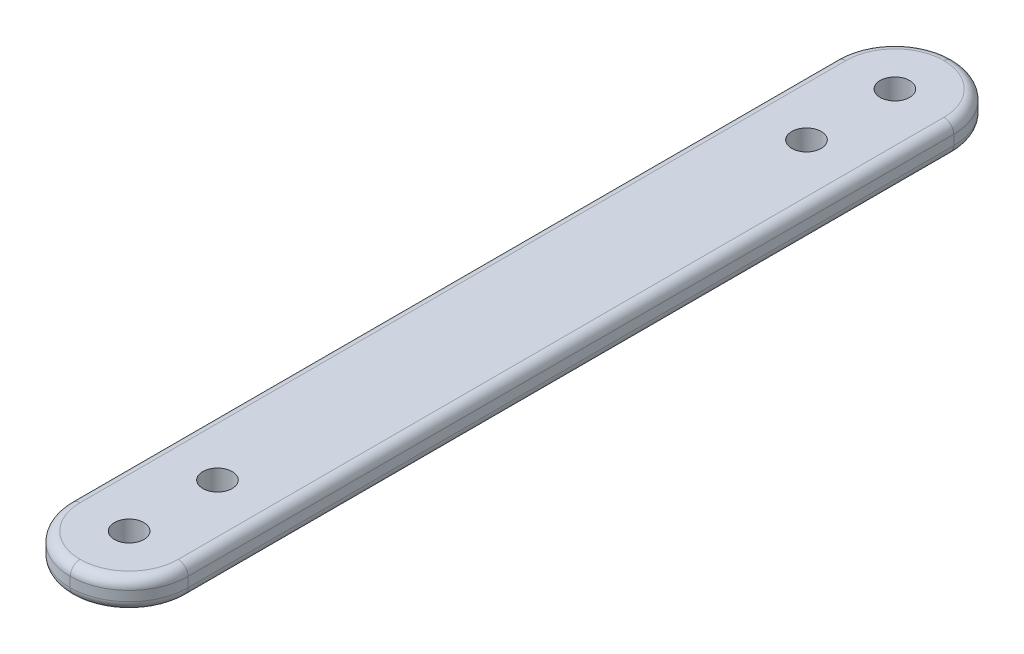
ISO-10303-21;
HEADER;
FILE_DESCRIPTION(('STEP AP214'),'2;1');
FILE_NAME('part.step','',(''),(''),'','','');
FILE_SCHEMA(('AUTOMOTIVE_DESIGN { 1 0 10303 214 1 1 1 1 }'));
ENDSEC;
DATA;
#1=APPLICATION_CONTEXT('core data for automotive mechanical design processes');
#2=APPLICATION_PROTOCOL_DEFINITION('international standard','automotive_design',2000,#1);
#3=PRODUCT_CONTEXT('',#1,'mechanical');
#4=PRODUCT('Part','Part','',(#3));
#5=PRODUCT_RELATED_PRODUCT_CATEGORY('part','',(#4));
#6=PRODUCT_DEFINITION_FORMATION('','',#4);
#7=PRODUCT_DEFINITION_CONTEXT('part definition',#1,'design');
#8=PRODUCT_DEFINITION('design','',#6,#7);
#9=PRODUCT_DEFINITION_SHAPE('','',#8);
#10=(LENGTH_UNIT() NAMED_UNIT(*) SI_UNIT(.MILLI.,.METRE.));
#11=(NAMED_UNIT(*) PLANE_ANGLE_UNIT() SI_UNIT($,.RADIAN.));
#12=(NAMED_UNIT(*) SI_UNIT($,.STERADIAN.) SOLID_ANGLE_UNIT());
#13=UNCERTAINTY_MEASURE_WITH_UNIT(LENGTH_MEASURE(1.E-05),#10,'distance_accuracy_value','');
#14=(GEOMETRIC_REPRESENTATION_CONTEXT(3) GLOBAL_UNCERTAINTY_ASSIGNED_CONTEXT((#13)) GLOBAL_UNIT_ASSIGNED_CONTEXT((#10,
#11,#12)) REPRESENTATION_CONTEXT('',''));
#15=CARTESIAN_POINT('',(0.,0.,0.));
#16=DIRECTION('',(0.,0.,1.));
#17=DIRECTION('',(1.,0.,0.));
#18=AXIS2_PLACEMENT_3D('',#15,#16,#17);
#19=CARTESIAN_POINT('',(0.,6.35,0.));
#20=DIRECTION('',(0.,-1.,0.));
#21=DIRECTION('',(0.,0.,-1.));
#22=AXIS2_PLACEMENT_3D('',#19,#20,#21);
#23=PLANE('',#22);
#24=CARTESIAN_POINT('',(0.,6.35,82.5500000000001));
#25=DIRECTION('',(0.,-1.,0.));
#26=DIRECTION('',(0.,0.,-1.));
#27=AXIS2_PLACEMENT_3D('',#24,#25,#26);
#28=CIRCLE('',#27,10.5833333333333);
#29=CARTESIAN_POINT('',(-10.5833333333333,6.35,82.5500000000001));
#30=VERTEX_POINT('',#29);
#31=CARTESIAN_POINT('',(0.,6.35,93.1333333333334));
#32=VERTEX_POINT('',#31);
#33=EDGE_CURVE('E150',#30,#32,#28,.F.);
#34=ORIENTED_EDGE('',*,*,#33,.T.);
#35=CARTESIAN_POINT('',(0.,6.35,82.5500000000001));
#36=DIRECTION('',(0.,-1.,0.));
#37=DIRECTION('',(0.,0.,-1.));
#38=AXIS2_PLACEMENT_3D('',#35,#36,#37);
#39=CIRCLE('',#38,10.5833333333333);
#40=CARTESIAN_POINT('',(10.5833333333333,6.35,82.5500000000001));
#41=VERTEX_POINT('',#40);
#42=EDGE_CURVE('E131',#32,#41,#39,.F.);
#43=ORIENTED_EDGE('',*,*,#42,.T.);
#44=DIRECTION('',(0.,0.,-1.));
#45=VECTOR('',#44,1.);
#46=CARTESIAN_POINT('',(10.5833333333333,6.35,0.));
#47=LINE('',#46,#45);
#48=CARTESIAN_POINT('',(10.5833333333333,6.35,-82.5499999999999));
#49=VERTEX_POINT('',#48);
#50=EDGE_CURVE('E139',#41,#49,#47,.T.);
#51=ORIENTED_EDGE('',*,*,#50,.T.);
#52=CARTESIAN_POINT('',(0.,6.35,-82.5499999999999));
#53=DIRECTION('',(0.,-1.,0.));
#54=DIRECTION('',(0.,0.,-1.));
#55=AXIS2_PLACEMENT_3D('',#52,#53,#54);
#56=CIRCLE('',#55,10.5833333333333);
#57=CARTESIAN_POINT('',(0.,6.35,-93.1333333333333));
#58=VERTEX_POINT('',#57);
#59=EDGE_CURVE('E145',#49,#58,#56,.F.);
#60=ORIENTED_EDGE('',*,*,#59,.T.);
#61=CARTESIAN_POINT('',(0.,6.35,-82.5499999999999));
#62=DIRECTION('',(0.,-1.,0.));
#63=DIRECTION('',(0.,0.,-1.));
#64=AXIS2_PLACEMENT_3D('',#61,#62,#63);
#65=CIRCLE('',#64,10.5833333333333);
#66=CARTESIAN_POINT('',(-10.5833333333333,6.35,-82.5499999999999));
#67=VERTEX_POINT('',#66);
#68=EDGE_CURVE('E254',#58,#67,#65,.F.);
#69=ORIENTED_EDGE('',*,*,#68,.T.);
#70=DIRECTION('',(0.,0.,1.));
#71=VECTOR('',#70,1.);
#72=CARTESIAN_POINT('',(-10.5833333333333,6.35,0.));
#73=LINE('',#72,#71);
#74=EDGE_CURVE('E156',#67,#30,#73,.T.);
#75=ORIENTED_EDGE('',*,*,#74,.T.);
#76=EDGE_LOOP('',(#34,#43,#51,#60,#69,#75));
#77=FACE_BOUND('',#76,.T.);
#78=CARTESIAN_POINT('',(0.,6.35,82.5500000000001));
#79=DIRECTION('',(0.,1.,0.));
#80=DIRECTION('',(0.,0.,1.));
#81=AXIS2_PLACEMENT_3D('',#78,#79,#80);
#82=CIRCLE('',#81,3.175);
#83=CARTESIAN_POINT('',(0.,6.35,85.7250000000001));
#84=VERTEX_POINT('',#83);
#85=EDGE_CURVE('E243',#84,#84,#82,.T.);
#86=ORIENTED_EDGE('',*,*,#85,.F.);
#87=EDGE_LOOP('',(#86));
#88=FACE_BOUND('',#87,.T.);
#89=CARTESIAN_POINT('',(0.,6.35,-63.4999999999999));
#90=DIRECTION('',(0.,1.,0.));
#91=DIRECTION('',(0.,0.,1.));
#92=AXIS2_PLACEMENT_3D('',#89,#90,#91);
#93=CIRCLE('',#92,3.175);
#94=CARTESIAN_POINT('',(0.,6.35,-60.3249999999999));
#95=VERTEX_POINT('',#94);
#96=EDGE_CURVE('E507',#95,#95,#93,.T.);
#97=ORIENTED_EDGE('',*,*,#96,.F.);
#98=EDGE_LOOP('',(#97));
#99=FACE_BOUND('',#98,.T.);
#100=CARTESIAN_POINT('',(0.,6.35,-82.5499999999999));
#101=DIRECTION('',(0.,1.,0.));
#102=DIRECTION('',(0.,0.,1.));
#103=AXIS2_PLACEMENT_3D('',#100,#101,#102);
#104=CIRCLE('',#103,3.17499999999999);
#105=CARTESIAN_POINT('',(0.,6.35,-79.3749999999999));
#106=VERTEX_POINT('',#105);
#107=EDGE_CURVE('E495',#106,#106,#104,.T.);
#108=ORIENTED_EDGE('',*,*,#107,.F.);
#109=EDGE_LOOP('',(#108));
#110=FACE_BOUND('',#109,.T.);
#111=CARTESIAN_POINT('',(0.,6.35,63.5000000000001));
#112=DIRECTION('',(0.,1.,0.));
#113=DIRECTION('',(0.,0.,1.));
#114=AXIS2_PLACEMENT_3D('',#111,#112,#113);
#115=CIRCLE('',#114,3.175);
#116=CARTESIAN_POINT('',(0.,6.35,66.6750000000001));
#117=VERTEX_POINT('',#116);
#118=EDGE_CURVE('E499',#117,#117,#115,.T.);
#119=ORIENTED_EDGE('',*,*,#118,.F.);
#120=EDGE_LOOP('',(#119));
#121=FACE_BOUND('',#120,.T.);
#122=ADVANCED_FACE('F34',(#77,#88,#99,#110,#121),#23,.F.);
#123=CARTESIAN_POINT('',(0.,0.,0.));
#124=DIRECTION('',(0.,-1.,0.));
#125=DIRECTION('',(0.,0.,-1.));
#126=AXIS2_PLACEMENT_3D('',#123,#124,#125);
#127=PLANE('',#126);
#128=DIRECTION('',(0.,0.,-1.));
#129=VECTOR('',#128,1.);
#130=CARTESIAN_POINT('',(10.5833333333333,0.,82.5500000000001));
#131=LINE('',#130,#129);
#132=CARTESIAN_POINT('',(10.5833333333333,0.,-82.5499999999999));
#133=VERTEX_POINT('',#132);
#134=CARTESIAN_POINT('',(10.5833333333333,0.,82.5500000000001));
#135=VERTEX_POINT('',#134);
#136=EDGE_CURVE('E177',#133,#135,#131,.F.);
#137=ORIENTED_EDGE('',*,*,#136,.T.);
#138=CARTESIAN_POINT('',(0.,0.,82.5500000000001));
#139=DIRECTION('',(0.,-1.,0.));
#140=DIRECTION('',(0.,0.,-1.));
#141=AXIS2_PLACEMENT_3D('',#138,#139,#140);
#142=CIRCLE('',#141,10.5833333333333);
#143=CARTESIAN_POINT('',(0.,0.,93.1333333333334));
#144=VERTEX_POINT('',#143);
#145=EDGE_CURVE('E186',#135,#144,#142,.T.);
#146=ORIENTED_EDGE('',*,*,#145,.T.);
#147=CARTESIAN_POINT('',(0.,0.,82.5500000000001));
#148=DIRECTION('',(0.,-1.,0.));
#149=DIRECTION('',(0.,0.,-1.));
#150=AXIS2_PLACEMENT_3D('',#147,#148,#149);
#151=CIRCLE('',#150,10.5833333333333);
#152=CARTESIAN_POINT('',(-10.5833333333333,0.,82.5500000000001));
#153=VERTEX_POINT('',#152);
#154=EDGE_CURVE('E58',#144,#153,#151,.T.);
#155=ORIENTED_EDGE('',*,*,#154,.T.);
#156=DIRECTION('',(0.,0.,1.));
#157=VECTOR('',#156,1.);
#158=CARTESIAN_POINT('',(-10.5833333333333,0.,-82.5499999999999));
#159=LINE('',#158,#157);
#160=CARTESIAN_POINT('',(-10.5833333333333,0.,-82.5499999999999));
#161=VERTEX_POINT('',#160);
#162=EDGE_CURVE('E183',#153,#161,#159,.F.);
#163=ORIENTED_EDGE('',*,*,#162,.T.);
#164=CARTESIAN_POINT('',(0.,0.,-82.5499999999999));
#165=DIRECTION('',(0.,-1.,0.));
#166=DIRECTION('',(0.,0.,-1.));
#167=AXIS2_PLACEMENT_3D('',#164,#165,#166);
#168=CIRCLE('',#167,10.5833333333333);
#169=CARTESIAN_POINT('',(0.,0.,-93.1333333333333));
#170=VERTEX_POINT('',#169);
#171=EDGE_CURVE('E181',#161,#170,#168,.T.);
#172=ORIENTED_EDGE('',*,*,#171,.T.);
#173=CARTESIAN_POINT('',(0.,0.,-82.5499999999999));
#174=DIRECTION('',(0.,-1.,0.));
#175=DIRECTION('',(0.,0.,-1.));
#176=AXIS2_PLACEMENT_3D('',#173,#174,#175);
#177=CIRCLE('',#176,10.5833333333333);
#178=EDGE_CURVE('E179',#170,#133,#177,.T.);
#179=ORIENTED_EDGE('',*,*,#178,.T.);
#180=EDGE_LOOP('',(#137,#146,#155,#163,#172,#179));
#181=FACE_BOUND('',#180,.T.);
#182=CARTESIAN_POINT('',(0.,0.,-82.5499999999999));
#183=DIRECTION('',(0.,1.,0.));
#184=DIRECTION('',(0.,0.,1.));
#185=AXIS2_PLACEMENT_3D('',#182,#183,#184);
#186=CIRCLE('',#185,3.17499999999999);
#187=CARTESIAN_POINT('',(0.,0.,-79.3749999999999));
#188=VERTEX_POINT('',#187);
#189=EDGE_CURVE('E498',#188,#188,#186,.T.);
#190=ORIENTED_EDGE('',*,*,#189,.T.);
#191=EDGE_LOOP('',(#190));
#192=FACE_BOUND('',#191,.T.);
#193=CARTESIAN_POINT('',(0.,0.,82.5500000000001));
#194=DIRECTION('',(0.,1.,0.));
#195=DIRECTION('',(0.,0.,1.));
#196=AXIS2_PLACEMENT_3D('',#193,#194,#195);
#197=CIRCLE('',#196,3.175);
#198=CARTESIAN_POINT('',(0.,0.,85.7250000000001));
#199=VERTEX_POINT('',#198);
#200=EDGE_CURVE('E510',#199,#199,#197,.T.);
#201=ORIENTED_EDGE('',*,*,#200,.T.);
#202=EDGE_LOOP('',(#201));
#203=FACE_BOUND('',#202,.T.);
#204=CARTESIAN_POINT('',(0.,0.,-63.4999999999999));
#205=DIRECTION('',(0.,1.,0.));
#206=DIRECTION('',(0.,0.,1.));
#207=AXIS2_PLACEMENT_3D('',#204,#205,#206);
#208=CIRCLE('',#207,3.175);
#209=CARTESIAN_POINT('',(0.,0.,-60.3249999999999));
#210=VERTEX_POINT('',#209);
#211=EDGE_CURVE('E501',#210,#210,#208,.T.);
#212=ORIENTED_EDGE('',*,*,#211,.T.);
#213=EDGE_LOOP('',(#212));
#214=FACE_BOUND('',#213,.T.);
#215=CARTESIAN_POINT('',(0.,0.,63.5000000000001));
#216=DIRECTION('',(0.,1.,0.));
#217=DIRECTION('',(0.,0.,1.));
#218=AXIS2_PLACEMENT_3D('',#215,#216,#217);
#219=CIRCLE('',#218,3.175);
#220=CARTESIAN_POINT('',(0.,0.,66.6750000000001));
#221=VERTEX_POINT('',#220);
#222=EDGE_CURVE('E250',#221,#221,#219,.T.);
#223=ORIENTED_EDGE('',*,*,#222,.T.);
#224=EDGE_LOOP('',(#223));
#225=FACE_BOUND('',#224,.T.);
#226=ADVANCED_FACE('F274',(#181,#192,#203,#214,#225),#127,.T.);
#227=CARTESIAN_POINT('',(12.7,6.35,95.2500000000001));
#228=DIRECTION('',(-1.,0.,0.));
#229=DIRECTION('',(0.,0.,1.));
#230=AXIS2_PLACEMENT_3D('',#227,#228,#229);
#231=PLANE('',#230);
#232=DIRECTION('',(0.,-1.,0.));
#233=VECTOR('',#232,1.);
#234=CARTESIAN_POINT('',(12.7,6.35,-82.5499999999999));
#235=LINE('',#234,#233);
#236=CARTESIAN_POINT('',(12.7,2.11666666666667,-82.5499999999999));
#237=VERTEX_POINT('',#236);
#238=CARTESIAN_POINT('',(12.7,4.23333333333333,-82.5499999999999));
#239=VERTEX_POINT('',#238);
#240=EDGE_CURVE('E146',#237,#239,#235,.F.);
#241=ORIENTED_EDGE('',*,*,#240,.T.);
#242=DIRECTION('',(0.,0.,-1.));
#243=VECTOR('',#242,1.);
#244=CARTESIAN_POINT('',(12.7,4.23333333333333,95.2500000000001));
#245=LINE('',#244,#243);
#246=CARTESIAN_POINT('',(12.7,4.23333333333333,82.5500000000001));
#247=VERTEX_POINT('',#246);
#248=EDGE_CURVE('E11',#239,#247,#245,.F.);
#249=ORIENTED_EDGE('',*,*,#248,.T.);
#250=DIRECTION('',(0.,-1.,0.));
#251=VECTOR('',#250,1.);
#252=CARTESIAN_POINT('',(12.7,6.35,82.5500000000001));
#253=LINE('',#252,#251);
#254=CARTESIAN_POINT('',(12.7,2.11666666666667,82.5500000000001));
#255=VERTEX_POINT('',#254);
#256=EDGE_CURVE('E238',#247,#255,#253,.T.);
#257=ORIENTED_EDGE('',*,*,#256,.T.);
#258=DIRECTION('',(0.,0.,-1.));
#259=VECTOR('',#258,1.);
#260=CARTESIAN_POINT('',(12.7,2.11666666666667,-82.5499999999999));
#261=LINE('',#260,#259);
#262=EDGE_CURVE('E43',#255,#237,#261,.T.);
#263=ORIENTED_EDGE('',*,*,#262,.T.);
#264=EDGE_LOOP('',(#241,#249,#257,#263));
#265=FACE_BOUND('',#264,.T.);
#266=ADVANCED_FACE('F284',(#265),#231,.F.);
#267=CARTESIAN_POINT('',(-12.7,6.35,95.2500000000001));
#268=DIRECTION('',(1.,0.,0.));
#269=DIRECTION('',(0.,0.,-1.));
#270=AXIS2_PLACEMENT_3D('',#267,#268,#269);
#271=PLANE('',#270);
#272=DIRECTION('',(0.,-1.,0.));
#273=VECTOR('',#272,1.);
#274=CARTESIAN_POINT('',(-12.7,6.35,82.5500000000001));
#275=LINE('',#274,#273);
#276=CARTESIAN_POINT('',(-12.7,2.11666666666667,82.5500000000001));
#277=VERTEX_POINT('',#276);
#278=CARTESIAN_POINT('',(-12.7,4.23333333333333,82.5500000000001));
#279=VERTEX_POINT('',#278);
#280=EDGE_CURVE('E239',#277,#279,#275,.F.);
#281=ORIENTED_EDGE('',*,*,#280,.T.);
#282=DIRECTION('',(0.,0.,1.));
#283=VECTOR('',#282,1.);
#284=CARTESIAN_POINT('',(-12.7,4.23333333333333,95.2500000000001));
#285=LINE('',#284,#283);
#286=CARTESIAN_POINT('',(-12.7,4.23333333333333,-82.5499999999999));
#287=VERTEX_POINT('',#286);
#288=EDGE_CURVE('E167',#279,#287,#285,.F.);
#289=ORIENTED_EDGE('',*,*,#288,.T.);
#290=DIRECTION('',(0.,-1.,0.));
#291=VECTOR('',#290,1.);
#292=CARTESIAN_POINT('',(-12.7,6.35,-82.5499999999999));
#293=LINE('',#292,#291);
#294=CARTESIAN_POINT('',(-12.7,2.11666666666667,-82.5499999999999));
#295=VERTEX_POINT('',#294);
#296=EDGE_CURVE('E229',#287,#295,#293,.T.);
#297=ORIENTED_EDGE('',*,*,#296,.T.);
#298=DIRECTION('',(0.,0.,1.));
#299=VECTOR('',#298,1.);
#300=CARTESIAN_POINT('',(-12.7,2.11666666666667,82.5500000000001));
#301=LINE('',#300,#299);
#302=EDGE_CURVE('E165',#295,#277,#301,.T.);
#303=ORIENTED_EDGE('',*,*,#302,.T.);
#304=EDGE_LOOP('',(#281,#289,#297,#303));
#305=FACE_BOUND('',#304,.T.);
#306=ADVANCED_FACE('F235',(#305),#271,.F.);
#307=CARTESIAN_POINT('',(0.,6.35,82.5500000000001));
#308=DIRECTION('',(0.,-1.,0.));
#309=DIRECTION('',(0.,0.,-1.));
#310=AXIS2_PLACEMENT_3D('',#307,#308,#309);
#311=CYLINDRICAL_SURFACE('',#310,3.175);
#312=ORIENTED_EDGE('',*,*,#85,.T.);
#313=EDGE_LOOP('',(#312));
#314=FACE_BOUND('',#313,.T.);
#315=ORIENTED_EDGE('',*,*,#200,.F.);
#316=EDGE_LOOP('',(#315));
#317=FACE_BOUND('',#316,.T.);
#318=ADVANCED_FACE('F312',(#314,#317),#311,.F.);
#319=CARTESIAN_POINT('',(0.,6.35,-63.4999999999999));
#320=DIRECTION('',(0.,-1.,0.));
#321=DIRECTION('',(0.,0.,-1.));
#322=AXIS2_PLACEMENT_3D('',#319,#320,#321);
#323=CYLINDRICAL_SURFACE('',#322,3.175);
#324=ORIENTED_EDGE('',*,*,#96,.T.);
#325=EDGE_LOOP('',(#324));
#326=FACE_BOUND('',#325,.T.);
#327=ORIENTED_EDGE('',*,*,#211,.F.);
#328=EDGE_LOOP('',(#327));
#329=FACE_BOUND('',#328,.T.);
#330=ADVANCED_FACE('F332',(#326,#329),#323,.F.);
#331=CARTESIAN_POINT('',(0.,6.35,-82.5499999999999));
#332=DIRECTION('',(0.,-1.,0.));
#333=DIRECTION('',(0.,0.,-1.));
#334=AXIS2_PLACEMENT_3D('',#331,#332,#333);
#335=CYLINDRICAL_SURFACE('',#334,3.17499999999999);
#336=ORIENTED_EDGE('',*,*,#107,.T.);
#337=EDGE_LOOP('',(#336));
#338=FACE_BOUND('',#337,.T.);
#339=ORIENTED_EDGE('',*,*,#189,.F.);
#340=EDGE_LOOP('',(#339));
#341=FACE_BOUND('',#340,.T.);
#342=ADVANCED_FACE('F301',(#338,#341),#335,.F.);
#343=CARTESIAN_POINT('',(0.,6.35,63.5000000000001));
#344=DIRECTION('',(0.,-1.,0.));
#345=DIRECTION('',(0.,0.,-1.));
#346=AXIS2_PLACEMENT_3D('',#343,#344,#345);
#347=CYLINDRICAL_SURFACE('',#346,3.175);
#348=ORIENTED_EDGE('',*,*,#118,.T.);
#349=EDGE_LOOP('',(#348));
#350=FACE_BOUND('',#349,.T.);
#351=ORIENTED_EDGE('',*,*,#222,.F.);
#352=EDGE_LOOP('',(#351));
#353=FACE_BOUND('',#352,.T.);
#354=ADVANCED_FACE('F294',(#350,#353),#347,.F.);
#355=CARTESIAN_POINT('',(0.,6.35,-82.5499999999999));
#356=DIRECTION('',(0.,-1.,0.));
#357=DIRECTION('',(0.,0.,-1.));
#358=AXIS2_PLACEMENT_3D('',#355,#356,#357);
#359=CYLINDRICAL_SURFACE('',#358,12.7);
#360=DIRECTION('',(0.,-1.,0.));
#361=VECTOR('',#360,1.);
#362=CARTESIAN_POINT('',(0.,6.35,-95.2499999999999));
#363=LINE('',#362,#361);
#364=CARTESIAN_POINT('',(0.,4.23333333333333,-95.2499999999999));
#365=VERTEX_POINT('',#364);
#366=CARTESIAN_POINT('',(0.,2.11666666666667,-95.2499999999999));
#367=VERTEX_POINT('',#366);
#368=EDGE_CURVE('E232',#365,#367,#363,.T.);
#369=ORIENTED_EDGE('',*,*,#368,.F.);
#370=CARTESIAN_POINT('',(0.,4.23333333333333,-82.5499999999999));
#371=DIRECTION('',(0.,-1.,0.));
#372=DIRECTION('',(0.,0.,-1.));
#373=AXIS2_PLACEMENT_3D('',#370,#371,#372);
#374=CIRCLE('',#373,12.7);
#375=EDGE_CURVE('E175',#365,#239,#374,.T.);
#376=ORIENTED_EDGE('',*,*,#375,.T.);
#377=ORIENTED_EDGE('',*,*,#240,.F.);
#378=CARTESIAN_POINT('',(0.,2.11666666666667,-82.5499999999999));
#379=DIRECTION('',(0.,-1.,0.));
#380=DIRECTION('',(0.,0.,-1.));
#381=AXIS2_PLACEMENT_3D('',#378,#379,#380);
#382=CIRCLE('',#381,12.7);
#383=EDGE_CURVE('E173',#237,#367,#382,.F.);
#384=ORIENTED_EDGE('',*,*,#383,.T.);
#385=EDGE_LOOP('',(#369,#376,#377,#384));
#386=FACE_BOUND('',#385,.T.);
#387=ADVANCED_FACE('F292',(#386),#359,.T.);
#388=CARTESIAN_POINT('',(0.,6.35,-82.5499999999999));
#389=DIRECTION('',(0.,-1.,0.));
#390=DIRECTION('',(0.,0.,-1.));
#391=AXIS2_PLACEMENT_3D('',#388,#389,#390);
#392=CYLINDRICAL_SURFACE('',#391,12.7);
#393=ORIENTED_EDGE('',*,*,#296,.F.);
#394=CARTESIAN_POINT('',(0.,4.23333333333333,-82.5499999999999));
#395=DIRECTION('',(0.,-1.,0.));
#396=DIRECTION('',(0.,0.,-1.));
#397=AXIS2_PLACEMENT_3D('',#394,#395,#396);
#398=CIRCLE('',#397,12.7);
#399=EDGE_CURVE('E171',#287,#365,#398,.T.);
#400=ORIENTED_EDGE('',*,*,#399,.T.);
#401=ORIENTED_EDGE('',*,*,#368,.T.);
#402=CARTESIAN_POINT('',(0.,2.11666666666667,-82.5499999999999));
#403=DIRECTION('',(0.,-1.,0.));
#404=DIRECTION('',(0.,0.,-1.));
#405=AXIS2_PLACEMENT_3D('',#402,#403,#404);
#406=CIRCLE('',#405,12.7);
#407=EDGE_CURVE('E169',#367,#295,#406,.F.);
#408=ORIENTED_EDGE('',*,*,#407,.T.);
#409=EDGE_LOOP('',(#393,#400,#401,#408));
#410=FACE_BOUND('',#409,.T.);
#411=ADVANCED_FACE('F228',(#410),#392,.T.);
#412=CARTESIAN_POINT('',(0.,6.35,82.5500000000001));
#413=DIRECTION('',(0.,-1.,0.));
#414=DIRECTION('',(0.,0.,-1.));
#415=AXIS2_PLACEMENT_3D('',#412,#413,#414);
#416=CYLINDRICAL_SURFACE('',#415,12.7);
#417=ORIENTED_EDGE('',*,*,#256,.F.);
#418=CARTESIAN_POINT('',(0.,4.23333333333333,82.5500000000001));
#419=DIRECTION('',(0.,-1.,0.));
#420=DIRECTION('',(0.,0.,-1.));
#421=AXIS2_PLACEMENT_3D('',#418,#419,#420);
#422=CIRCLE('',#421,12.7);
#423=CARTESIAN_POINT('',(0.,4.23333333333333,95.2500000000001));
#424=VERTEX_POINT('',#423);
#425=EDGE_CURVE('E133',#247,#424,#422,.T.);
#426=ORIENTED_EDGE('',*,*,#425,.T.);
#427=DIRECTION('',(0.,-1.,0.));
#428=VECTOR('',#427,1.);
#429=CARTESIAN_POINT('',(0.,6.35,95.2500000000001));
#430=LINE('',#429,#428);
#431=CARTESIAN_POINT('',(0.,2.11666666666667,95.2500000000001));
#432=VERTEX_POINT('',#431);
#433=EDGE_CURVE('E200',#432,#424,#430,.F.);
#434=ORIENTED_EDGE('',*,*,#433,.F.);
#435=CARTESIAN_POINT('',(0.,2.11666666666667,82.5500000000001));
#436=DIRECTION('',(0.,-1.,0.));
#437=DIRECTION('',(0.,0.,-1.));
#438=AXIS2_PLACEMENT_3D('',#435,#436,#437);
#439=CIRCLE('',#438,12.7);
#440=EDGE_CURVE('E152',#432,#255,#439,.F.);
#441=ORIENTED_EDGE('',*,*,#440,.T.);
#442=EDGE_LOOP('',(#417,#426,#434,#441));
#443=FACE_BOUND('',#442,.T.);
#444=ADVANCED_FACE('F268',(#443),#416,.T.);
#445=CARTESIAN_POINT('',(0.,6.35,82.5500000000001));
#446=DIRECTION('',(0.,-1.,0.));
#447=DIRECTION('',(0.,0.,-1.));
#448=AXIS2_PLACEMENT_3D('',#445,#446,#447);
#449=CYLINDRICAL_SURFACE('',#448,12.7);
#450=ORIENTED_EDGE('',*,*,#433,.T.);
#451=CARTESIAN_POINT('',(0.,4.23333333333333,82.5500000000001));
#452=DIRECTION('',(0.,-1.,0.));
#453=DIRECTION('',(0.,0.,-1.));
#454=AXIS2_PLACEMENT_3D('',#451,#452,#453);
#455=CIRCLE('',#454,12.7);
#456=EDGE_CURVE('E163',#424,#279,#455,.T.);
#457=ORIENTED_EDGE('',*,*,#456,.T.);
#458=ORIENTED_EDGE('',*,*,#280,.F.);
#459=CARTESIAN_POINT('',(0.,2.11666666666667,82.5500000000001));
#460=DIRECTION('',(0.,-1.,0.));
#461=DIRECTION('',(0.,0.,-1.));
#462=AXIS2_PLACEMENT_3D('',#459,#460,#461);
#463=CIRCLE('',#462,12.7);
#464=EDGE_CURVE('E161',#277,#432,#463,.F.);
#465=ORIENTED_EDGE('',*,*,#464,.T.);
#466=EDGE_LOOP('',(#450,#457,#458,#465));
#467=FACE_BOUND('',#466,.T.);
#468=ADVANCED_FACE('F269',(#467),#449,.T.);
#469=CARTESIAN_POINT('',(0.,4.23333333333333,-82.5499999999999));
#470=DIRECTION('',(0.,-1.,0.));
#471=DIRECTION('',(0.,0.,-1.));
#472=AXIS2_PLACEMENT_3D('',#469,#470,#471);
#473=TOROIDAL_SURFACE('',#472,10.5833333333333,2.11666666666667);
#474=CARTESIAN_POINT('',(0.,4.23333333333333,-93.1333333333333));
#475=DIRECTION('',(1.,0.,0.));
#476=DIRECTION('',(0.,0.,-1.));
#477=AXIS2_PLACEMENT_3D('',#474,#475,#476);
#478=CIRCLE('',#477,2.11666666666667);
#479=EDGE_CURVE('E194',#365,#58,#478,.T.);
#480=ORIENTED_EDGE('',*,*,#479,.F.);
#481=ORIENTED_EDGE('',*,*,#399,.F.);
#482=CARTESIAN_POINT('',(-10.5833333333333,4.23333333333333,-82.5499999999999));
#483=DIRECTION('',(0.,0.,1.));
#484=DIRECTION('',(1.,0.,0.));
#485=AXIS2_PLACEMENT_3D('',#482,#483,#484);
#486=CIRCLE('',#485,2.11666666666667);
#487=EDGE_CURVE('E197',#67,#287,#486,.T.);
#488=ORIENTED_EDGE('',*,*,#487,.F.);
#489=ORIENTED_EDGE('',*,*,#68,.F.);
#490=EDGE_LOOP('',(#480,#481,#488,#489));
#491=FACE_BOUND('',#490,.T.);
#492=ADVANCED_FACE('F291',(#491),#473,.T.);
#493=CARTESIAN_POINT('',(-10.5833333333333,4.23333333333333,0.));
#494=DIRECTION('',(0.,0.,1.));
#495=DIRECTION('',(1.,0.,0.));
#496=AXIS2_PLACEMENT_3D('',#493,#494,#495);
#497=CYLINDRICAL_SURFACE('',#496,2.11666666666667);
#498=ORIENTED_EDGE('',*,*,#487,.T.);
#499=ORIENTED_EDGE('',*,*,#288,.F.);
#500=CARTESIAN_POINT('',(-10.5833333333333,4.23333333333333,82.5500000000001));
#501=DIRECTION('',(0.,0.,1.));
#502=DIRECTION('',(1.,0.,0.));
#503=AXIS2_PLACEMENT_3D('',#500,#501,#502);
#504=CIRCLE('',#503,2.11666666666667);
#505=EDGE_CURVE('E191',#30,#279,#504,.T.);
#506=ORIENTED_EDGE('',*,*,#505,.F.);
#507=ORIENTED_EDGE('',*,*,#74,.F.);
#508=EDGE_LOOP('',(#498,#499,#506,#507));
#509=FACE_BOUND('',#508,.T.);
#510=ADVANCED_FACE('F260',(#509),#497,.T.);
#511=CARTESIAN_POINT('',(0.,4.23333333333333,-82.5499999999999));
#512=DIRECTION('',(0.,-1.,0.));
#513=DIRECTION('',(0.,0.,-1.));
#514=AXIS2_PLACEMENT_3D('',#511,#512,#513);
#515=TOROIDAL_SURFACE('',#514,10.5833333333333,2.11666666666667);
#516=ORIENTED_EDGE('',*,*,#479,.T.);
#517=ORIENTED_EDGE('',*,*,#59,.F.);
#518=CARTESIAN_POINT('',(10.5833333333333,4.23333333333333,-82.5499999999999));
#519=DIRECTION('',(0.,0.,1.));
#520=DIRECTION('',(1.,0.,0.));
#521=AXIS2_PLACEMENT_3D('',#518,#519,#520);
#522=CIRCLE('',#521,2.11666666666667);
#523=EDGE_CURVE('E142',#239,#49,#522,.T.);
#524=ORIENTED_EDGE('',*,*,#523,.F.);
#525=ORIENTED_EDGE('',*,*,#375,.F.);
#526=EDGE_LOOP('',(#516,#517,#524,#525));
#527=FACE_BOUND('',#526,.T.);
#528=ADVANCED_FACE('F288',(#527),#515,.T.);
#529=CARTESIAN_POINT('',(0.,4.23333333333333,82.5500000000001));
#530=DIRECTION('',(0.,-1.,0.));
#531=DIRECTION('',(0.,0.,-1.));
#532=AXIS2_PLACEMENT_3D('',#529,#530,#531);
#533=TOROIDAL_SURFACE('',#532,10.5833333333333,2.11666666666667);
#534=ORIENTED_EDGE('',*,*,#505,.T.);
#535=ORIENTED_EDGE('',*,*,#456,.F.);
#536=CARTESIAN_POINT('',(0.,4.23333333333333,93.1333333333334));
#537=DIRECTION('',(1.,0.,0.));
#538=DIRECTION('',(0.,0.,-1.));
#539=AXIS2_PLACEMENT_3D('',#536,#537,#538);
#540=CIRCLE('',#539,2.11666666666667);
#541=EDGE_CURVE('E136',#32,#424,#540,.T.);
#542=ORIENTED_EDGE('',*,*,#541,.F.);
#543=ORIENTED_EDGE('',*,*,#33,.F.);
#544=EDGE_LOOP('',(#534,#535,#542,#543));
#545=FACE_BOUND('',#544,.T.);
#546=ADVANCED_FACE('F263',(#545),#533,.T.);
#547=CARTESIAN_POINT('',(10.5833333333333,4.23333333333333,0.));
#548=DIRECTION('',(0.,0.,-1.));
#549=DIRECTION('',(-1.,0.,0.));
#550=AXIS2_PLACEMENT_3D('',#547,#548,#549);
#551=CYLINDRICAL_SURFACE('',#550,2.11666666666667);
#552=ORIENTED_EDGE('',*,*,#523,.T.);
#553=ORIENTED_EDGE('',*,*,#50,.F.);
#554=CARTESIAN_POINT('',(10.5833333333333,4.23333333333333,82.5500000000001));
#555=DIRECTION('',(0.,0.,1.));
#556=DIRECTION('',(1.,0.,0.));
#557=AXIS2_PLACEMENT_3D('',#554,#555,#556);
#558=CIRCLE('',#557,2.11666666666667);
#559=EDGE_CURVE('E127',#247,#41,#558,.T.);
#560=ORIENTED_EDGE('',*,*,#559,.F.);
#561=ORIENTED_EDGE('',*,*,#248,.F.);
#562=EDGE_LOOP('',(#552,#553,#560,#561));
#563=FACE_BOUND('',#562,.T.);
#564=ADVANCED_FACE('F140',(#563),#551,.T.);
#565=CARTESIAN_POINT('',(0.,4.23333333333333,82.5500000000001));
#566=DIRECTION('',(0.,-1.,0.));
#567=DIRECTION('',(0.,0.,-1.));
#568=AXIS2_PLACEMENT_3D('',#565,#566,#567);
#569=TOROIDAL_SURFACE('',#568,10.5833333333333,2.11666666666667);
#570=ORIENTED_EDGE('',*,*,#541,.T.);
#571=ORIENTED_EDGE('',*,*,#425,.F.);
#572=ORIENTED_EDGE('',*,*,#559,.T.);
#573=ORIENTED_EDGE('',*,*,#42,.F.);
#574=EDGE_LOOP('',(#570,#571,#572,#573));
#575=FACE_BOUND('',#574,.T.);
#576=ADVANCED_FACE('F129',(#575),#569,.T.);
#577=CARTESIAN_POINT('',(0.,2.11666666666667,-82.5499999999999));
#578=DIRECTION('',(0.,-1.,0.));
#579=DIRECTION('',(0.,0.,-1.));
#580=AXIS2_PLACEMENT_3D('',#577,#578,#579);
#581=TOROIDAL_SURFACE('',#580,10.5833333333333,2.11666666666667);
#582=CARTESIAN_POINT('',(-10.5833333333333,2.11666666666667,-82.5499999999999));
#583=DIRECTION('',(0.,0.,1.));
#584=DIRECTION('',(1.,0.,0.));
#585=AXIS2_PLACEMENT_3D('',#582,#583,#584);
#586=CIRCLE('',#585,2.11666666666667);
#587=EDGE_CURVE('E209',#295,#161,#586,.T.);
#588=ORIENTED_EDGE('',*,*,#587,.F.);
#589=ORIENTED_EDGE('',*,*,#407,.F.);
#590=CARTESIAN_POINT('',(0.,2.11666666666667,-93.1333333333333));
#591=DIRECTION('',(1.,0.,0.));
#592=DIRECTION('',(0.,0.,-1.));
#593=AXIS2_PLACEMENT_3D('',#590,#591,#592);
#594=CIRCLE('',#593,2.11666666666667);
#595=EDGE_CURVE('E38',#170,#367,#594,.T.);
#596=ORIENTED_EDGE('',*,*,#595,.F.);
#597=ORIENTED_EDGE('',*,*,#171,.F.);
#598=EDGE_LOOP('',(#588,#589,#596,#597));
#599=FACE_BOUND('',#598,.T.);
#600=ADVANCED_FACE('F36',(#599),#581,.T.);
#601=CARTESIAN_POINT('',(0.,2.11666666666667,-82.5499999999999));
#602=DIRECTION('',(0.,-1.,0.));
#603=DIRECTION('',(0.,0.,-1.));
#604=AXIS2_PLACEMENT_3D('',#601,#602,#603);
#605=TOROIDAL_SURFACE('',#604,10.5833333333333,2.11666666666667);
#606=ORIENTED_EDGE('',*,*,#595,.T.);
#607=ORIENTED_EDGE('',*,*,#383,.F.);
#608=CARTESIAN_POINT('',(10.5833333333333,2.11666666666667,-82.5499999999999));
#609=DIRECTION('',(0.,0.,1.));
#610=DIRECTION('',(1.,0.,0.));
#611=AXIS2_PLACEMENT_3D('',#608,#609,#610);
#612=CIRCLE('',#611,2.11666666666667);
#613=EDGE_CURVE('E207',#133,#237,#612,.T.);
#614=ORIENTED_EDGE('',*,*,#613,.F.);
#615=ORIENTED_EDGE('',*,*,#178,.F.);
#616=EDGE_LOOP('',(#606,#607,#614,#615));
#617=FACE_BOUND('',#616,.T.);
#618=ADVANCED_FACE('F219',(#617),#605,.T.);
#619=CARTESIAN_POINT('',(-10.5833333333333,2.11666666666667,95.2500000000001));
#620=DIRECTION('',(0.,0.,-1.));
#621=DIRECTION('',(-1.,0.,0.));
#622=AXIS2_PLACEMENT_3D('',#619,#620,#621);
#623=CYLINDRICAL_SURFACE('',#622,2.11666666666667);
#624=ORIENTED_EDGE('',*,*,#587,.T.);
#625=ORIENTED_EDGE('',*,*,#162,.F.);
#626=CARTESIAN_POINT('',(-10.5833333333333,2.11666666666667,82.5500000000001));
#627=DIRECTION('',(0.,0.,1.));
#628=DIRECTION('',(1.,0.,0.));
#629=AXIS2_PLACEMENT_3D('',#626,#627,#628);
#630=CIRCLE('',#629,2.11666666666667);
#631=EDGE_CURVE('E204',#277,#153,#630,.T.);
#632=ORIENTED_EDGE('',*,*,#631,.F.);
#633=ORIENTED_EDGE('',*,*,#302,.F.);
#634=EDGE_LOOP('',(#624,#625,#632,#633));
#635=FACE_BOUND('',#634,.T.);
#636=ADVANCED_FACE('F448',(#635),#623,.T.);
#637=CARTESIAN_POINT('',(10.5833333333334,2.11666666666667,95.2500000000001));
#638=DIRECTION('',(0.,0.,1.));
#639=DIRECTION('',(1.,0.,0.));
#640=AXIS2_PLACEMENT_3D('',#637,#638,#639);
#641=CYLINDRICAL_SURFACE('',#640,2.11666666666667);
#642=ORIENTED_EDGE('',*,*,#613,.T.);
#643=ORIENTED_EDGE('',*,*,#262,.F.);
#644=CARTESIAN_POINT('',(10.5833333333333,2.11666666666667,82.5500000000001));
#645=DIRECTION('',(0.,0.,1.));
#646=DIRECTION('',(1.,0.,0.));
#647=AXIS2_PLACEMENT_3D('',#644,#645,#646);
#648=CIRCLE('',#647,2.11666666666667);
#649=EDGE_CURVE('E202',#135,#255,#648,.T.);
#650=ORIENTED_EDGE('',*,*,#649,.F.);
#651=ORIENTED_EDGE('',*,*,#136,.F.);
#652=EDGE_LOOP('',(#642,#643,#650,#651));
#653=FACE_BOUND('',#652,.T.);
#654=ADVANCED_FACE('F281',(#653),#641,.T.);
#655=CARTESIAN_POINT('',(0.,2.11666666666667,82.5500000000001));
#656=DIRECTION('',(0.,-1.,0.));
#657=DIRECTION('',(0.,0.,-1.));
#658=AXIS2_PLACEMENT_3D('',#655,#656,#657);
#659=TOROIDAL_SURFACE('',#658,10.5833333333333,2.11666666666667);
#660=ORIENTED_EDGE('',*,*,#631,.T.);
#661=ORIENTED_EDGE('',*,*,#154,.F.);
#662=CARTESIAN_POINT('',(0.,2.11666666666667,93.1333333333334));
#663=DIRECTION('',(1.,0.,0.));
#664=DIRECTION('',(0.,0.,-1.));
#665=AXIS2_PLACEMENT_3D('',#662,#663,#664);
#666=CIRCLE('',#665,2.11666666666667);
#667=EDGE_CURVE('E51',#432,#144,#666,.T.);
#668=ORIENTED_EDGE('',*,*,#667,.F.);
#669=ORIENTED_EDGE('',*,*,#464,.F.);
#670=EDGE_LOOP('',(#660,#661,#668,#669));
#671=FACE_BOUND('',#670,.T.);
#672=ADVANCED_FACE('F273',(#671),#659,.T.);
#673=CARTESIAN_POINT('',(0.,2.11666666666667,82.5500000000001));
#674=DIRECTION('',(0.,-1.,0.));
#675=DIRECTION('',(0.,0.,-1.));
#676=AXIS2_PLACEMENT_3D('',#673,#674,#675);
#677=TOROIDAL_SURFACE('',#676,10.5833333333333,2.11666666666667);
#678=ORIENTED_EDGE('',*,*,#649,.T.);
#679=ORIENTED_EDGE('',*,*,#440,.F.);
#680=ORIENTED_EDGE('',*,*,#667,.T.);
#681=ORIENTED_EDGE('',*,*,#145,.F.);
#682=EDGE_LOOP('',(#678,#679,#680,#681));
#683=FACE_BOUND('',#682,.T.);
#684=ADVANCED_FACE('F278',(#683),#677,.T.);
#685=CLOSED_SHELL('',(#122,#226,#266,#306,#318,#330,#342,#354,#387,#411,#444,#468,#492,#510,
#528,#546,#564,#576,#600,#618,#636,#654,#672,#684));
#686=MANIFOLD_SOLID_BREP('B2',#685);
#687=ADVANCED_BREP_SHAPE_REPRESENTATION('',(#18,#686),#14);
#688=SHAPE_DEFINITION_REPRESENTATION(#9,#687);
ENDSEC;
END-ISO-10303-21;
